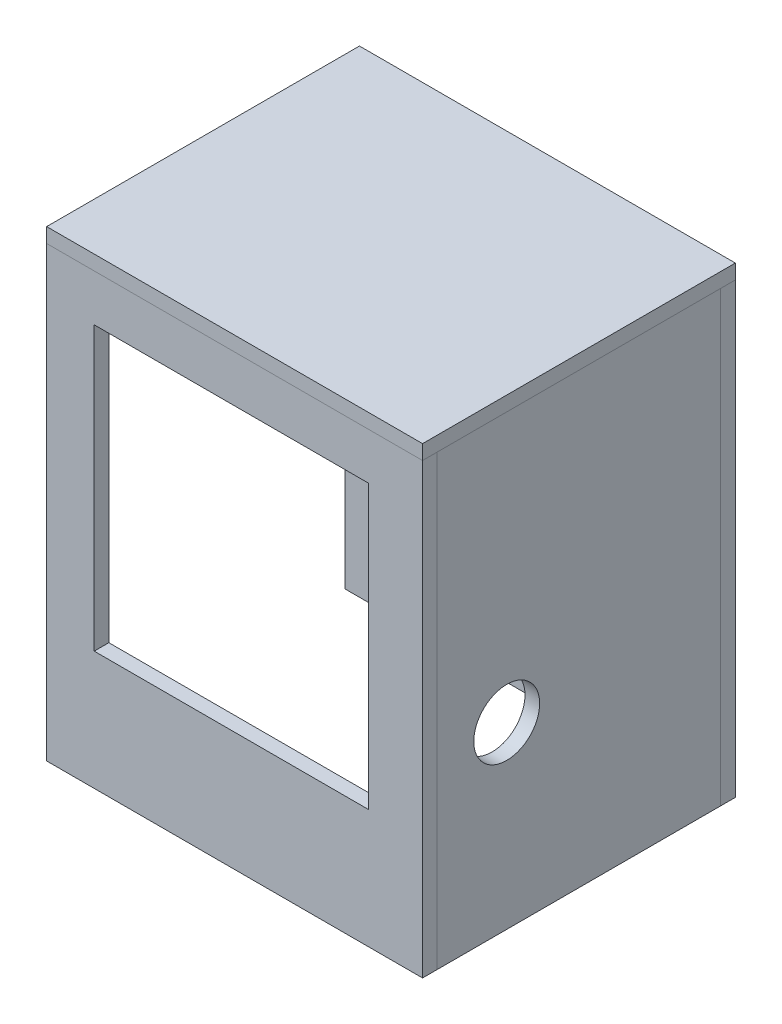
ISO-10303-21;
HEADER;
FILE_DESCRIPTION(('STEP AP214'),'2;1');
FILE_NAME('part.step','',(''),(''),'','','');
FILE_SCHEMA(('AUTOMOTIVE_DESIGN { 1 0 10303 214 1 1 1 1 }'));
ENDSEC;
DATA;
#1=APPLICATION_CONTEXT('core data for automotive mechanical design processes');
#2=APPLICATION_PROTOCOL_DEFINITION('international standard','automotive_design',2000,#1);
#3=PRODUCT_CONTEXT('',#1,'mechanical');
#4=PRODUCT('Part','Part','',(#3));
#5=PRODUCT_RELATED_PRODUCT_CATEGORY('part','',(#4));
#6=PRODUCT_DEFINITION_FORMATION('','',#4);
#7=PRODUCT_DEFINITION_CONTEXT('part definition',#1,'design');
#8=PRODUCT_DEFINITION('design','',#6,#7);
#9=PRODUCT_DEFINITION_SHAPE('','',#8);
#10=(LENGTH_UNIT() NAMED_UNIT(*) SI_UNIT(.MILLI.,.METRE.));
#11=(NAMED_UNIT(*) PLANE_ANGLE_UNIT() SI_UNIT($,.RADIAN.));
#12=(NAMED_UNIT(*) SI_UNIT($,.STERADIAN.) SOLID_ANGLE_UNIT());
#13=UNCERTAINTY_MEASURE_WITH_UNIT(LENGTH_MEASURE(1.E-05),#10,'distance_accuracy_value','');
#14=(GEOMETRIC_REPRESENTATION_CONTEXT(3) GLOBAL_UNCERTAINTY_ASSIGNED_CONTEXT((#13)) GLOBAL_UNIT_ASSIGNED_CONTEXT((#10,
#11,#12)) REPRESENTATION_CONTEXT('',''));
#15=CARTESIAN_POINT('',(0.,0.,0.));
#16=DIRECTION('',(0.,0.,1.));
#17=DIRECTION('',(1.,0.,0.));
#18=AXIS2_PLACEMENT_3D('',#15,#16,#17);
#19=CARTESIAN_POINT('',(658.8125,803.275,-517.525));
#20=DIRECTION('',(0.,0.,1.));
#21=DIRECTION('',(1.,0.,0.));
#22=AXIS2_PLACEMENT_3D('',#19,#20,#21);
#23=PLANE('',#22);
#24=DIRECTION('',(0.,-1.,0.));
#25=VECTOR('',#24,1.);
#26=CARTESIAN_POINT('',(6.35,803.275,-517.525));
#27=LINE('',#26,#25);
#28=CARTESIAN_POINT('',(6.35,803.275,-517.525));
#29=VERTEX_POINT('',#28);
#30=CARTESIAN_POINT('',(6.34999999999997,777.875,-517.525));
#31=VERTEX_POINT('',#30);
#32=EDGE_CURVE('E57',#29,#31,#27,.T.);
#33=ORIENTED_EDGE('',*,*,#32,.F.);
#34=DIRECTION('',(-1.,0.,0.));
#35=VECTOR('',#34,1.);
#36=CARTESIAN_POINT('',(658.8125,803.275,-517.525));
#37=LINE('',#36,#35);
#38=CARTESIAN_POINT('',(658.8125,803.275,-517.525));
#39=VERTEX_POINT('',#38);
#40=EDGE_CURVE('E108',#39,#29,#37,.T.);
#41=ORIENTED_EDGE('',*,*,#40,.F.);
#42=DIRECTION('',(0.,-1.,0.));
#43=VECTOR('',#42,1.);
#44=CARTESIAN_POINT('',(658.8125,803.275,-517.525));
#45=LINE('',#44,#43);
#46=CARTESIAN_POINT('',(658.8125,777.875,-517.525));
#47=VERTEX_POINT('',#46);
#48=EDGE_CURVE('E51',#39,#47,#45,.T.);
#49=ORIENTED_EDGE('',*,*,#48,.T.);
#50=DIRECTION('',(-1.,0.,0.));
#51=VECTOR('',#50,1.);
#52=CARTESIAN_POINT('',(658.8125,777.875,-517.525));
#53=LINE('',#52,#51);
#54=EDGE_CURVE('E90',#47,#31,#53,.T.);
#55=ORIENTED_EDGE('',*,*,#54,.T.);
#56=EDGE_LOOP('',(#33,#41,#49,#55));
#57=FACE_BOUND('',#56,.T.);
#58=ADVANCED_FACE('F43',(#57),#23,.F.);
#59=CARTESIAN_POINT('',(658.8125,803.275,25.4));
#60=DIRECTION('',(0.,0.,-1.));
#61=DIRECTION('',(-1.,0.,0.));
#62=AXIS2_PLACEMENT_3D('',#59,#60,#61);
#63=PLANE('',#62);
#64=DIRECTION('',(0.,1.,0.));
#65=VECTOR('',#64,1.);
#66=CARTESIAN_POINT('',(6.35,803.275,25.4));
#67=LINE('',#66,#65);
#68=CARTESIAN_POINT('',(6.35,777.875,25.4));
#69=VERTEX_POINT('',#68);
#70=CARTESIAN_POINT('',(6.35,803.275,25.4));
#71=VERTEX_POINT('',#70);
#72=EDGE_CURVE('E86',#69,#71,#67,.T.);
#73=ORIENTED_EDGE('',*,*,#72,.F.);
#74=DIRECTION('',(1.,0.,0.));
#75=VECTOR('',#74,1.);
#76=CARTESIAN_POINT('',(658.8125,777.875,25.4));
#77=LINE('',#76,#75);
#78=CARTESIAN_POINT('',(658.8125,777.875,25.4));
#79=VERTEX_POINT('',#78);
#80=EDGE_CURVE('E80',#69,#79,#77,.T.);
#81=ORIENTED_EDGE('',*,*,#80,.T.);
#82=DIRECTION('',(0.,-1.,0.));
#83=VECTOR('',#82,1.);
#84=CARTESIAN_POINT('',(658.8125,803.275,25.4));
#85=LINE('',#84,#83);
#86=CARTESIAN_POINT('',(658.8125,803.275,25.4));
#87=VERTEX_POINT('',#86);
#88=EDGE_CURVE('E83',#87,#79,#85,.T.);
#89=ORIENTED_EDGE('',*,*,#88,.F.);
#90=DIRECTION('',(1.,0.,0.));
#91=VECTOR('',#90,1.);
#92=CARTESIAN_POINT('',(658.8125,803.275,25.4));
#93=LINE('',#92,#91);
#94=EDGE_CURVE('E66',#71,#87,#93,.T.);
#95=ORIENTED_EDGE('',*,*,#94,.F.);
#96=EDGE_LOOP('',(#73,#81,#89,#95));
#97=FACE_BOUND('',#96,.T.);
#98=ADVANCED_FACE('F82',(#97),#63,.F.);
#99=CARTESIAN_POINT('',(0.,803.275,0.));
#100=DIRECTION('',(0.,1.,0.));
#101=DIRECTION('',(0.,0.,1.));
#102=AXIS2_PLACEMENT_3D('',#99,#100,#101);
#103=PLANE('',#102);
#104=ORIENTED_EDGE('',*,*,#40,.T.);
#105=DIRECTION('',(0.,0.,-1.));
#106=VECTOR('',#105,1.);
#107=CARTESIAN_POINT('',(6.35,803.275,-517.525));
#108=LINE('',#107,#106);
#109=EDGE_CURVE('E100',#71,#29,#108,.T.);
#110=ORIENTED_EDGE('',*,*,#109,.F.);
#111=ORIENTED_EDGE('',*,*,#94,.T.);
#112=DIRECTION('',(0.,0.,-1.));
#113=VECTOR('',#112,1.);
#114=CARTESIAN_POINT('',(658.8125,803.275,25.4));
#115=LINE('',#114,#113);
#116=EDGE_CURVE('E89',#87,#39,#115,.T.);
#117=ORIENTED_EDGE('',*,*,#116,.T.);
#118=EDGE_LOOP('',(#104,#110,#111,#117));
#119=FACE_BOUND('',#118,.T.);
#120=ADVANCED_FACE('F110',(#119),#103,.T.);
#121=CARTESIAN_POINT('',(0.,777.875,0.));
#122=DIRECTION('',(0.,1.,0.));
#123=DIRECTION('',(0.,0.,1.));
#124=AXIS2_PLACEMENT_3D('',#121,#122,#123);
#125=PLANE('',#124);
#126=DIRECTION('',(0.,0.,1.));
#127=VECTOR('',#126,1.);
#128=CARTESIAN_POINT('',(6.35,777.875,0.));
#129=LINE('',#128,#127);
#130=EDGE_CURVE('E12',#31,#69,#129,.T.);
#131=ORIENTED_EDGE('',*,*,#130,.F.);
#132=ORIENTED_EDGE('',*,*,#54,.F.);
#133=DIRECTION('',(0.,0.,-1.));
#134=VECTOR('',#133,1.);
#135=CARTESIAN_POINT('',(658.8125,777.875,25.4));
#136=LINE('',#135,#134);
#137=EDGE_CURVE('E95',#79,#47,#136,.T.);
#138=ORIENTED_EDGE('',*,*,#137,.F.);
#139=ORIENTED_EDGE('',*,*,#80,.F.);
#140=EDGE_LOOP('',(#131,#132,#138,#139));
#141=FACE_BOUND('',#140,.T.);
#142=ADVANCED_FACE('F97',(#141),#125,.F.);
#143=CARTESIAN_POINT('',(658.8125,803.275,25.4));
#144=DIRECTION('',(-1.,0.,0.));
#145=DIRECTION('',(0.,0.,1.));
#146=AXIS2_PLACEMENT_3D('',#143,#144,#145);
#147=PLANE('',#146);
#148=ORIENTED_EDGE('',*,*,#137,.T.);
#149=ORIENTED_EDGE('',*,*,#48,.F.);
#150=ORIENTED_EDGE('',*,*,#116,.F.);
#151=ORIENTED_EDGE('',*,*,#88,.T.);
#152=EDGE_LOOP('',(#148,#149,#150,#151));
#153=FACE_BOUND('',#152,.T.);
#154=ADVANCED_FACE('F45',(#153),#147,.F.);
#155=CARTESIAN_POINT('',(6.35,0.,0.));
#156=DIRECTION('',(-1.,0.,0.));
#157=DIRECTION('',(0.,0.,1.));
#158=AXIS2_PLACEMENT_3D('',#155,#156,#157);
#159=PLANE('',#158);
#160=ORIENTED_EDGE('',*,*,#130,.T.);
#161=ORIENTED_EDGE('',*,*,#72,.T.);
#162=ORIENTED_EDGE('',*,*,#109,.T.);
#163=ORIENTED_EDGE('',*,*,#32,.T.);
#164=EDGE_LOOP('',(#160,#161,#162,#163));
#165=FACE_BOUND('',#164,.T.);
#166=ADVANCED_FACE('F115',(#165),#159,.T.);
#167=CLOSED_SHELL('',(#58,#98,#120,#142,#154,#166));
#168=MANIFOLD_SOLID_BREP('B2',#167);
#169=CARTESIAN_POINT('',(658.8125,0.,-517.525));
#170=DIRECTION('',(0.,1.,0.));
#171=DIRECTION('',(0.,0.,1.));
#172=AXIS2_PLACEMENT_3D('',#169,#170,#171);
#173=PLANE('',#172);
#174=DIRECTION('',(0.,0.,1.));
#175=VECTOR('',#174,1.);
#176=CARTESIAN_POINT('',(6.35,0.,-517.525));
#177=LINE('',#176,#175);
#178=CARTESIAN_POINT('',(6.35,0.,-517.525));
#179=VERTEX_POINT('',#178);
#180=CARTESIAN_POINT('',(6.34999999999997,0.,-492.125));
#181=VERTEX_POINT('',#180);
#182=EDGE_CURVE('E190',#179,#181,#177,.T.);
#183=ORIENTED_EDGE('',*,*,#182,.F.);
#184=DIRECTION('',(-1.,0.,0.));
#185=VECTOR('',#184,1.);
#186=CARTESIAN_POINT('',(658.8125,0.,-517.525));
#187=LINE('',#186,#185);
#188=CARTESIAN_POINT('',(658.8125,0.,-517.525));
#189=VERTEX_POINT('',#188);
#190=EDGE_CURVE('E240',#189,#179,#187,.T.);
#191=ORIENTED_EDGE('',*,*,#190,.F.);
#192=DIRECTION('',(0.,0.,1.));
#193=VECTOR('',#192,1.);
#194=CARTESIAN_POINT('',(658.8125,0.,-517.525));
#195=LINE('',#194,#193);
#196=CARTESIAN_POINT('',(658.8125,0.,-492.125));
#197=VERTEX_POINT('',#196);
#198=EDGE_CURVE('E184',#189,#197,#195,.T.);
#199=ORIENTED_EDGE('',*,*,#198,.T.);
#200=DIRECTION('',(-1.,0.,0.));
#201=VECTOR('',#200,1.);
#202=CARTESIAN_POINT('',(658.8125,0.,-492.125));
#203=LINE('',#202,#201);
#204=EDGE_CURVE('E223',#197,#181,#203,.T.);
#205=ORIENTED_EDGE('',*,*,#204,.T.);
#206=EDGE_LOOP('',(#183,#191,#199,#205));
#207=FACE_BOUND('',#206,.T.);
#208=ADVANCED_FACE('F176',(#207),#173,.F.);
#209=CARTESIAN_POINT('',(658.8125,777.875,-517.525));
#210=DIRECTION('',(0.,-1.,0.));
#211=DIRECTION('',(0.,0.,-1.));
#212=AXIS2_PLACEMENT_3D('',#209,#210,#211);
#213=PLANE('',#212);
#214=DIRECTION('',(0.,0.,-1.));
#215=VECTOR('',#214,1.);
#216=CARTESIAN_POINT('',(6.34999999999997,777.875,-517.525));
#217=LINE('',#216,#215);
#218=CARTESIAN_POINT('',(6.35,777.875,-492.125));
#219=VERTEX_POINT('',#218);
#220=CARTESIAN_POINT('',(6.35,777.875,-517.525));
#221=VERTEX_POINT('',#220);
#222=EDGE_CURVE('E219',#219,#221,#217,.T.);
#223=ORIENTED_EDGE('',*,*,#222,.F.);
#224=DIRECTION('',(1.,0.,0.));
#225=VECTOR('',#224,1.);
#226=CARTESIAN_POINT('',(658.8125,777.875,-492.125));
#227=LINE('',#226,#225);
#228=CARTESIAN_POINT('',(658.8125,777.875,-492.125));
#229=VERTEX_POINT('',#228);
#230=EDGE_CURVE('E213',#219,#229,#227,.T.);
#231=ORIENTED_EDGE('',*,*,#230,.T.);
#232=DIRECTION('',(0.,0.,1.));
#233=VECTOR('',#232,1.);
#234=CARTESIAN_POINT('',(658.8125,777.875,-517.525));
#235=LINE('',#234,#233);
#236=CARTESIAN_POINT('',(658.8125,777.875,-517.525));
#237=VERTEX_POINT('',#236);
#238=EDGE_CURVE('E216',#237,#229,#235,.T.);
#239=ORIENTED_EDGE('',*,*,#238,.F.);
#240=DIRECTION('',(1.,0.,0.));
#241=VECTOR('',#240,1.);
#242=CARTESIAN_POINT('',(658.8125,777.875,-517.525));
#243=LINE('',#242,#241);
#244=EDGE_CURVE('E199',#221,#237,#243,.T.);
#245=ORIENTED_EDGE('',*,*,#244,.F.);
#246=EDGE_LOOP('',(#223,#231,#239,#245));
#247=FACE_BOUND('',#246,.T.);
#248=ADVANCED_FACE('F215',(#247),#213,.F.);
#249=CARTESIAN_POINT('',(0.,0.,-517.525));
#250=DIRECTION('',(0.,0.,-1.));
#251=DIRECTION('',(-1.,0.,0.));
#252=AXIS2_PLACEMENT_3D('',#249,#250,#251);
#253=PLANE('',#252);
#254=ORIENTED_EDGE('',*,*,#190,.T.);
#255=DIRECTION('',(0.,-1.,0.));
#256=VECTOR('',#255,1.);
#257=CARTESIAN_POINT('',(6.35,803.275,-517.525));
#258=LINE('',#257,#256);
#259=EDGE_CURVE('E246',#221,#179,#258,.T.);
#260=ORIENTED_EDGE('',*,*,#259,.F.);
#261=ORIENTED_EDGE('',*,*,#244,.T.);
#262=DIRECTION('',(0.,-1.,0.));
#263=VECTOR('',#262,1.);
#264=CARTESIAN_POINT('',(658.8125,777.875,-517.525));
#265=LINE('',#264,#263);
#266=EDGE_CURVE('E222',#237,#189,#265,.T.);
#267=ORIENTED_EDGE('',*,*,#266,.T.);
#268=EDGE_LOOP('',(#254,#260,#261,#267));
#269=FACE_BOUND('',#268,.T.);
#270=ADVANCED_FACE('F242',(#269),#253,.T.);
#271=CARTESIAN_POINT('',(0.,0.,-492.125));
#272=DIRECTION('',(0.,0.,-1.));
#273=DIRECTION('',(-1.,0.,0.));
#274=AXIS2_PLACEMENT_3D('',#271,#272,#273);
#275=PLANE('',#274);
#276=DIRECTION('',(0.,1.,0.));
#277=VECTOR('',#276,1.);
#278=CARTESIAN_POINT('',(6.35,0.,-492.125));
#279=LINE('',#278,#277);
#280=EDGE_CURVE('E41',#181,#219,#279,.T.);
#281=ORIENTED_EDGE('',*,*,#280,.F.);
#282=ORIENTED_EDGE('',*,*,#204,.F.);
#283=DIRECTION('',(0.,-1.,0.));
#284=VECTOR('',#283,1.);
#285=CARTESIAN_POINT('',(658.8125,777.875,-492.125));
#286=LINE('',#285,#284);
#287=EDGE_CURVE('E228',#229,#197,#286,.T.);
#288=ORIENTED_EDGE('',*,*,#287,.F.);
#289=ORIENTED_EDGE('',*,*,#230,.F.);
#290=EDGE_LOOP('',(#281,#282,#288,#289));
#291=FACE_BOUND('',#290,.T.);
#292=ADVANCED_FACE('F230',(#291),#275,.F.);
#293=CARTESIAN_POINT('',(658.8125,777.875,-517.525));
#294=DIRECTION('',(-1.,0.,0.));
#295=DIRECTION('',(0.,-1.,0.));
#296=AXIS2_PLACEMENT_3D('',#293,#294,#295);
#297=PLANE('',#296);
#298=ORIENTED_EDGE('',*,*,#287,.T.);
#299=ORIENTED_EDGE('',*,*,#198,.F.);
#300=ORIENTED_EDGE('',*,*,#266,.F.);
#301=ORIENTED_EDGE('',*,*,#238,.T.);
#302=EDGE_LOOP('',(#298,#299,#300,#301));
#303=FACE_BOUND('',#302,.T.);
#304=ADVANCED_FACE('F178',(#303),#297,.F.);
#305=CARTESIAN_POINT('',(6.35,0.,0.));
#306=DIRECTION('',(-1.,0.,0.));
#307=DIRECTION('',(0.,0.,1.));
#308=AXIS2_PLACEMENT_3D('',#305,#306,#307);
#309=PLANE('',#308);
#310=ORIENTED_EDGE('',*,*,#222,.T.);
#311=ORIENTED_EDGE('',*,*,#259,.T.);
#312=ORIENTED_EDGE('',*,*,#182,.T.);
#313=ORIENTED_EDGE('',*,*,#280,.T.);
#314=EDGE_LOOP('',(#310,#311,#312,#313));
#315=FACE_BOUND('',#314,.T.);
#316=ADVANCED_FACE('F247',(#315),#309,.T.);
#317=CLOSED_SHELL('',(#208,#248,#270,#292,#304,#316));
#318=MANIFOLD_SOLID_BREP('B6',#317);
#319=CARTESIAN_POINT('',(658.8125,0.,-492.125));
#320=DIRECTION('',(-1.,0.,0.));
#321=DIRECTION('',(0.,0.,1.));
#322=AXIS2_PLACEMENT_3D('',#319,#320,#321);
#323=PLANE('',#322);
#324=CARTESIAN_POINT('',(658.8125,311.15,-120.65));
#325=DIRECTION('',(1.,0.,0.));
#326=DIRECTION('',(0.,0.,-1.));
#327=AXIS2_PLACEMENT_3D('',#324,#325,#326);
#328=CIRCLE('',#327,57.15);
#329=CARTESIAN_POINT('',(658.8125,311.15,-177.8));
#330=VERTEX_POINT('',#329);
#331=EDGE_CURVE('E386',#330,#330,#328,.T.);
#332=ORIENTED_EDGE('',*,*,#331,.F.);
#333=EDGE_LOOP('',(#332));
#334=FACE_BOUND('',#333,.T.);
#335=DIRECTION('',(0.,-1.,0.));
#336=VECTOR('',#335,1.);
#337=CARTESIAN_POINT('',(658.8125,0.,0.));
#338=LINE('',#337,#336);
#339=CARTESIAN_POINT('',(658.8125,777.875,0.));
#340=VERTEX_POINT('',#339);
#341=CARTESIAN_POINT('',(658.8125,0.,0.));
#342=VERTEX_POINT('',#341);
#343=EDGE_CURVE('E372',#340,#342,#338,.T.);
#344=ORIENTED_EDGE('',*,*,#343,.T.);
#345=DIRECTION('',(0.,0.,1.));
#346=VECTOR('',#345,1.);
#347=CARTESIAN_POINT('',(658.8125,0.,-492.125));
#348=LINE('',#347,#346);
#349=CARTESIAN_POINT('',(658.8125,0.,-492.125));
#350=VERTEX_POINT('',#349);
#351=EDGE_CURVE('E174',#350,#342,#348,.T.);
#352=ORIENTED_EDGE('',*,*,#351,.F.);
#353=DIRECTION('',(0.,-1.,0.));
#354=VECTOR('',#353,1.);
#355=CARTESIAN_POINT('',(658.8125,0.,-492.125));
#356=LINE('',#355,#354);
#357=CARTESIAN_POINT('',(658.8125,777.875,-492.125));
#358=VERTEX_POINT('',#357);
#359=EDGE_CURVE('E360',#358,#350,#356,.T.);
#360=ORIENTED_EDGE('',*,*,#359,.F.);
#361=DIRECTION('',(0.,0.,1.));
#362=VECTOR('',#361,1.);
#363=CARTESIAN_POINT('',(658.8125,777.875,-492.125));
#364=LINE('',#363,#362);
#365=EDGE_CURVE('E368',#358,#340,#364,.T.);
#366=ORIENTED_EDGE('',*,*,#365,.T.);
#367=EDGE_LOOP('',(#344,#352,#360,#366));
#368=FACE_BOUND('',#367,.T.);
#369=ADVANCED_FACE('F309',(#334,#368),#323,.F.);
#370=CARTESIAN_POINT('',(658.8125,0.,-492.125));
#371=DIRECTION('',(0.,1.,0.));
#372=DIRECTION('',(0.,0.,1.));
#373=AXIS2_PLACEMENT_3D('',#370,#371,#372);
#374=PLANE('',#373);
#375=DIRECTION('',(-1.,0.,0.));
#376=VECTOR('',#375,1.);
#377=CARTESIAN_POINT('',(658.8125,0.,0.));
#378=LINE('',#377,#376);
#379=CARTESIAN_POINT('',(633.4125,0.,0.));
#380=VERTEX_POINT('',#379);
#381=EDGE_CURVE('E364',#342,#380,#378,.T.);
#382=ORIENTED_EDGE('',*,*,#381,.T.);
#383=DIRECTION('',(0.,0.,1.));
#384=VECTOR('',#383,1.);
#385=CARTESIAN_POINT('',(633.4125,0.,-492.125));
#386=LINE('',#385,#384);
#387=CARTESIAN_POINT('',(633.4125,0.,-492.125));
#388=VERTEX_POINT('',#387);
#389=EDGE_CURVE('E317',#388,#380,#386,.T.);
#390=ORIENTED_EDGE('',*,*,#389,.F.);
#391=DIRECTION('',(-1.,0.,0.));
#392=VECTOR('',#391,1.);
#393=CARTESIAN_POINT('',(658.8125,0.,-492.125));
#394=LINE('',#393,#392);
#395=EDGE_CURVE('E355',#350,#388,#394,.T.);
#396=ORIENTED_EDGE('',*,*,#395,.F.);
#397=ORIENTED_EDGE('',*,*,#351,.T.);
#398=EDGE_LOOP('',(#382,#390,#396,#397));
#399=FACE_BOUND('',#398,.T.);
#400=ADVANCED_FACE('F363',(#399),#374,.F.);
#401=CARTESIAN_POINT('',(633.4125,0.,-492.125));
#402=DIRECTION('',(1.,0.,0.));
#403=DIRECTION('',(0.,0.,-1.));
#404=AXIS2_PLACEMENT_3D('',#401,#402,#403);
#405=PLANE('',#404);
#406=CARTESIAN_POINT('',(633.4125,311.15,-120.65));
#407=DIRECTION('',(1.,0.,0.));
#408=DIRECTION('',(0.,0.,-1.));
#409=AXIS2_PLACEMENT_3D('',#406,#407,#408);
#410=CIRCLE('',#409,57.15);
#411=CARTESIAN_POINT('',(633.4125,311.15,-177.8));
#412=VERTEX_POINT('',#411);
#413=EDGE_CURVE('E375',#412,#412,#410,.T.);
#414=ORIENTED_EDGE('',*,*,#413,.T.);
#415=EDGE_LOOP('',(#414));
#416=FACE_BOUND('',#415,.T.);
#417=DIRECTION('',(0.,1.,0.));
#418=VECTOR('',#417,1.);
#419=CARTESIAN_POINT('',(633.4125,0.,0.));
#420=LINE('',#419,#418);
#421=CARTESIAN_POINT('',(633.4125,777.875,0.));
#422=VERTEX_POINT('',#421);
#423=EDGE_CURVE('E342',#380,#422,#420,.T.);
#424=ORIENTED_EDGE('',*,*,#423,.T.);
#425=DIRECTION('',(0.,0.,1.));
#426=VECTOR('',#425,1.);
#427=CARTESIAN_POINT('',(633.4125,777.875,-492.125));
#428=LINE('',#427,#426);
#429=CARTESIAN_POINT('',(633.4125,777.875,-492.125));
#430=VERTEX_POINT('',#429);
#431=EDGE_CURVE('E365',#430,#422,#428,.T.);
#432=ORIENTED_EDGE('',*,*,#431,.F.);
#433=DIRECTION('',(0.,1.,0.));
#434=VECTOR('',#433,1.);
#435=CARTESIAN_POINT('',(633.4125,0.,-492.125));
#436=LINE('',#435,#434);
#437=EDGE_CURVE('E358',#388,#430,#436,.T.);
#438=ORIENTED_EDGE('',*,*,#437,.F.);
#439=ORIENTED_EDGE('',*,*,#389,.T.);
#440=EDGE_LOOP('',(#424,#432,#438,#439));
#441=FACE_BOUND('',#440,.T.);
#442=ADVANCED_FACE('F366',(#416,#441),#405,.F.);
#443=CARTESIAN_POINT('',(658.8125,777.875,-492.125));
#444=DIRECTION('',(0.,-1.,0.));
#445=DIRECTION('',(0.,0.,-1.));
#446=AXIS2_PLACEMENT_3D('',#443,#444,#445);
#447=PLANE('',#446);
#448=DIRECTION('',(1.,0.,0.));
#449=VECTOR('',#448,1.);
#450=CARTESIAN_POINT('',(658.8125,777.875,0.));
#451=LINE('',#450,#449);
#452=EDGE_CURVE('E348',#422,#340,#451,.T.);
#453=ORIENTED_EDGE('',*,*,#452,.T.);
#454=ORIENTED_EDGE('',*,*,#365,.F.);
#455=DIRECTION('',(1.,0.,0.));
#456=VECTOR('',#455,1.);
#457=CARTESIAN_POINT('',(658.8125,777.875,-492.125));
#458=LINE('',#457,#456);
#459=EDGE_CURVE('E325',#430,#358,#458,.T.);
#460=ORIENTED_EDGE('',*,*,#459,.F.);
#461=ORIENTED_EDGE('',*,*,#431,.T.);
#462=EDGE_LOOP('',(#453,#454,#460,#461));
#463=FACE_BOUND('',#462,.T.);
#464=ADVANCED_FACE('F380',(#463),#447,.F.);
#465=CARTESIAN_POINT('',(0.,0.,-492.125));
#466=DIRECTION('',(0.,0.,1.));
#467=DIRECTION('',(1.,0.,0.));
#468=AXIS2_PLACEMENT_3D('',#465,#466,#467);
#469=PLANE('',#468);
#470=ORIENTED_EDGE('',*,*,#359,.T.);
#471=ORIENTED_EDGE('',*,*,#395,.T.);
#472=ORIENTED_EDGE('',*,*,#437,.T.);
#473=ORIENTED_EDGE('',*,*,#459,.T.);
#474=EDGE_LOOP('',(#470,#471,#472,#473));
#475=FACE_BOUND('',#474,.T.);
#476=ADVANCED_FACE('F356',(#475),#469,.F.);
#477=CARTESIAN_POINT('',(0.,0.,0.));
#478=DIRECTION('',(0.,0.,1.));
#479=DIRECTION('',(1.,0.,0.));
#480=AXIS2_PLACEMENT_3D('',#477,#478,#479);
#481=PLANE('',#480);
#482=ORIENTED_EDGE('',*,*,#343,.F.);
#483=ORIENTED_EDGE('',*,*,#452,.F.);
#484=ORIENTED_EDGE('',*,*,#423,.F.);
#485=ORIENTED_EDGE('',*,*,#381,.F.);
#486=EDGE_LOOP('',(#482,#483,#484,#485));
#487=FACE_BOUND('',#486,.T.);
#488=ADVANCED_FACE('F383',(#487),#481,.T.);
#489=CARTESIAN_POINT('',(633.4125,311.15,-120.65));
#490=DIRECTION('',(1.,0.,0.));
#491=DIRECTION('',(0.,0.,-1.));
#492=AXIS2_PLACEMENT_3D('',#489,#490,#491);
#493=CYLINDRICAL_SURFACE('',#492,57.15);
#494=ORIENTED_EDGE('',*,*,#413,.F.);
#495=EDGE_LOOP('',(#494));
#496=FACE_BOUND('',#495,.T.);
#497=ORIENTED_EDGE('',*,*,#331,.T.);
#498=EDGE_LOOP('',(#497));
#499=FACE_BOUND('',#498,.T.);
#500=ADVANCED_FACE('F393',(#496,#499),#493,.F.);
#501=CLOSED_SHELL('',(#369,#400,#442,#464,#476,#488,#500));
#502=MANIFOLD_SOLID_BREP('B35',#501);
#503=CARTESIAN_POINT('',(0.,0.,25.4));
#504=DIRECTION('',(0.,1.,0.));
#505=DIRECTION('',(0.,0.,1.));
#506=AXIS2_PLACEMENT_3D('',#503,#504,#505);
#507=PLANE('',#506);
#508=DIRECTION('',(0.,0.,1.));
#509=VECTOR('',#508,1.);
#510=CARTESIAN_POINT('',(6.35,0.,-517.525));
#511=LINE('',#510,#509);
#512=CARTESIAN_POINT('',(6.35,0.,0.));
#513=VERTEX_POINT('',#512);
#514=CARTESIAN_POINT('',(6.35,0.,25.4));
#515=VERTEX_POINT('',#514);
#516=EDGE_CURVE('E523',#513,#515,#511,.T.);
#517=ORIENTED_EDGE('',*,*,#516,.F.);
#518=DIRECTION('',(1.,0.,0.));
#519=VECTOR('',#518,1.);
#520=CARTESIAN_POINT('',(0.,0.,0.));
#521=LINE('',#520,#519);
#522=CARTESIAN_POINT('',(658.8125,0.,0.));
#523=VERTEX_POINT('',#522);
#524=EDGE_CURVE('E557',#513,#523,#521,.T.);
#525=ORIENTED_EDGE('',*,*,#524,.T.);
#526=DIRECTION('',(0.,0.,-1.));
#527=VECTOR('',#526,1.);
#528=CARTESIAN_POINT('',(658.8125,0.,25.4));
#529=LINE('',#528,#527);
#530=CARTESIAN_POINT('',(658.8125,0.,25.4));
#531=VERTEX_POINT('',#530);
#532=EDGE_CURVE('E460',#531,#523,#529,.T.);
#533=ORIENTED_EDGE('',*,*,#532,.F.);
#534=DIRECTION('',(1.,0.,0.));
#535=VECTOR('',#534,1.);
#536=CARTESIAN_POINT('',(0.,0.,25.4));
#537=LINE('',#536,#535);
#538=EDGE_CURVE('E558',#515,#531,#537,.T.);
#539=ORIENTED_EDGE('',*,*,#538,.F.);
#540=EDGE_LOOP('',(#517,#525,#533,#539));
#541=FACE_BOUND('',#540,.T.);
#542=ADVANCED_FACE('F453',(#541),#507,.F.);
#543=CARTESIAN_POINT('',(0.,777.875,25.4));
#544=DIRECTION('',(0.,-1.,0.));
#545=DIRECTION('',(0.,0.,-1.));
#546=AXIS2_PLACEMENT_3D('',#543,#544,#545);
#547=PLANE('',#546);
#548=DIRECTION('',(0.,0.,-1.));
#549=VECTOR('',#548,1.);
#550=CARTESIAN_POINT('',(6.35,777.875,25.4));
#551=LINE('',#550,#549);
#552=CARTESIAN_POINT('',(6.35,777.875,25.4));
#553=VERTEX_POINT('',#552);
#554=CARTESIAN_POINT('',(6.35,777.875,0.));
#555=VERTEX_POINT('',#554);
#556=EDGE_CURVE('E555',#553,#555,#551,.T.);
#557=ORIENTED_EDGE('',*,*,#556,.F.);
#558=DIRECTION('',(-1.,0.,0.));
#559=VECTOR('',#558,1.);
#560=CARTESIAN_POINT('',(0.,777.875,25.4));
#561=LINE('',#560,#559);
#562=CARTESIAN_POINT('',(658.8125,777.875,25.4));
#563=VERTEX_POINT('',#562);
#564=EDGE_CURVE('E563',#563,#553,#561,.T.);
#565=ORIENTED_EDGE('',*,*,#564,.F.);
#566=DIRECTION('',(0.,0.,-1.));
#567=VECTOR('',#566,1.);
#568=CARTESIAN_POINT('',(658.8125,777.875,25.4));
#569=LINE('',#568,#567);
#570=CARTESIAN_POINT('',(658.8125,777.875,0.));
#571=VERTEX_POINT('',#570);
#572=EDGE_CURVE('E566',#563,#571,#569,.T.);
#573=ORIENTED_EDGE('',*,*,#572,.T.);
#574=DIRECTION('',(-1.,0.,0.));
#575=VECTOR('',#574,1.);
#576=CARTESIAN_POINT('',(0.,777.875,0.));
#577=LINE('',#576,#575);
#578=EDGE_CURVE('E561',#571,#555,#577,.T.);
#579=ORIENTED_EDGE('',*,*,#578,.T.);
#580=EDGE_LOOP('',(#557,#565,#573,#579));
#581=FACE_BOUND('',#580,.T.);
#582=ADVANCED_FACE('F586',(#581),#547,.F.);
#583=CARTESIAN_POINT('',(0.,0.,25.4));
#584=DIRECTION('',(0.,0.,-1.));
#585=DIRECTION('',(-1.,0.,0.));
#586=AXIS2_PLACEMENT_3D('',#583,#584,#585);
#587=PLANE('',#586);
#588=DIRECTION('',(1.,0.,0.));
#589=VECTOR('',#588,1.);
#590=CARTESIAN_POINT('',(88.9,206.375,25.4));
#591=LINE('',#590,#589);
#592=CARTESIAN_POINT('',(88.9,206.375,25.4));
#593=VERTEX_POINT('',#592);
#594=CARTESIAN_POINT('',(565.15,206.375,25.4));
#595=VERTEX_POINT('',#594);
#596=EDGE_CURVE('E536',#593,#595,#591,.T.);
#597=ORIENTED_EDGE('',*,*,#596,.F.);
#598=DIRECTION('',(0.,-1.,0.));
#599=VECTOR('',#598,1.);
#600=CARTESIAN_POINT('',(88.9,696.9125,25.4));
#601=LINE('',#600,#599);
#602=CARTESIAN_POINT('',(88.9,696.9125,25.4));
#603=VERTEX_POINT('',#602);
#604=EDGE_CURVE('E467',#603,#593,#601,.T.);
#605=ORIENTED_EDGE('',*,*,#604,.F.);
#606=DIRECTION('',(-1.,0.,0.));
#607=VECTOR('',#606,1.);
#608=CARTESIAN_POINT('',(88.9,696.9125,25.4));
#609=LINE('',#608,#607);
#610=CARTESIAN_POINT('',(565.15,696.9125,25.4));
#611=VERTEX_POINT('',#610);
#612=EDGE_CURVE('E529',#611,#603,#609,.T.);
#613=ORIENTED_EDGE('',*,*,#612,.F.);
#614=DIRECTION('',(0.,1.,0.));
#615=VECTOR('',#614,1.);
#616=CARTESIAN_POINT('',(565.15,696.9125,25.4));
#617=LINE('',#616,#615);
#618=EDGE_CURVE('E543',#595,#611,#617,.T.);
#619=ORIENTED_EDGE('',*,*,#618,.F.);
#620=EDGE_LOOP('',(#597,#605,#613,#619));
#621=FACE_BOUND('',#620,.T.);
#622=DIRECTION('',(0.,1.,0.));
#623=VECTOR('',#622,1.);
#624=CARTESIAN_POINT('',(6.35,803.275,25.4));
#625=LINE('',#624,#623);
#626=EDGE_CURVE('E553',#515,#553,#625,.T.);
#627=ORIENTED_EDGE('',*,*,#626,.F.);
#628=ORIENTED_EDGE('',*,*,#538,.T.);
#629=DIRECTION('',(0.,1.,0.));
#630=VECTOR('',#629,1.);
#631=CARTESIAN_POINT('',(658.8125,0.,25.4));
#632=LINE('',#631,#630);
#633=EDGE_CURVE('E560',#531,#563,#632,.T.);
#634=ORIENTED_EDGE('',*,*,#633,.T.);
#635=ORIENTED_EDGE('',*,*,#564,.T.);
#636=EDGE_LOOP('',(#627,#628,#634,#635));
#637=FACE_BOUND('',#636,.T.);
#638=ADVANCED_FACE('F590',(#621,#637),#587,.F.);
#639=CARTESIAN_POINT('',(0.,0.,0.));
#640=DIRECTION('',(0.,0.,-1.));
#641=DIRECTION('',(-1.,0.,0.));
#642=AXIS2_PLACEMENT_3D('',#639,#640,#641);
#643=PLANE('',#642);
#644=DIRECTION('',(0.,-1.,0.));
#645=VECTOR('',#644,1.);
#646=CARTESIAN_POINT('',(88.9,696.9125,0.));
#647=LINE('',#646,#645);
#648=CARTESIAN_POINT('',(88.9,696.9125,0.));
#649=VERTEX_POINT('',#648);
#650=CARTESIAN_POINT('',(88.9,206.375,0.));
#651=VERTEX_POINT('',#650);
#652=EDGE_CURVE('E527',#649,#651,#647,.T.);
#653=ORIENTED_EDGE('',*,*,#652,.T.);
#654=DIRECTION('',(1.,0.,0.));
#655=VECTOR('',#654,1.);
#656=CARTESIAN_POINT('',(88.9,206.375,0.));
#657=LINE('',#656,#655);
#658=CARTESIAN_POINT('',(565.15,206.375,0.));
#659=VERTEX_POINT('',#658);
#660=EDGE_CURVE('E516',#651,#659,#657,.T.);
#661=ORIENTED_EDGE('',*,*,#660,.T.);
#662=DIRECTION('',(0.,1.,0.));
#663=VECTOR('',#662,1.);
#664=CARTESIAN_POINT('',(565.15,696.9125,0.));
#665=LINE('',#664,#663);
#666=CARTESIAN_POINT('',(565.15,696.9125,0.));
#667=VERTEX_POINT('',#666);
#668=EDGE_CURVE('E538',#659,#667,#665,.T.);
#669=ORIENTED_EDGE('',*,*,#668,.T.);
#670=DIRECTION('',(-1.,0.,0.));
#671=VECTOR('',#670,1.);
#672=CARTESIAN_POINT('',(88.9,696.9125,0.));
#673=LINE('',#672,#671);
#674=EDGE_CURVE('E534',#667,#649,#673,.T.);
#675=ORIENTED_EDGE('',*,*,#674,.T.);
#676=EDGE_LOOP('',(#653,#661,#669,#675));
#677=FACE_BOUND('',#676,.T.);
#678=ORIENTED_EDGE('',*,*,#524,.F.);
#679=DIRECTION('',(0.,1.,0.));
#680=VECTOR('',#679,1.);
#681=CARTESIAN_POINT('',(6.35,0.,0.));
#682=LINE('',#681,#680);
#683=EDGE_CURVE('E307',#513,#555,#682,.T.);
#684=ORIENTED_EDGE('',*,*,#683,.T.);
#685=ORIENTED_EDGE('',*,*,#578,.F.);
#686=DIRECTION('',(0.,1.,0.));
#687=VECTOR('',#686,1.);
#688=CARTESIAN_POINT('',(658.8125,0.,0.));
#689=LINE('',#688,#687);
#690=EDGE_CURVE('E568',#523,#571,#689,.T.);
#691=ORIENTED_EDGE('',*,*,#690,.F.);
#692=EDGE_LOOP('',(#678,#684,#685,#691));
#693=FACE_BOUND('',#692,.T.);
#694=ADVANCED_FACE('F532',(#677,#693),#643,.T.);
#695=CARTESIAN_POINT('',(658.8125,0.,25.4));
#696=DIRECTION('',(-1.,0.,0.));
#697=DIRECTION('',(0.,0.,1.));
#698=AXIS2_PLACEMENT_3D('',#695,#696,#697);
#699=PLANE('',#698);
#700=ORIENTED_EDGE('',*,*,#690,.T.);
#701=ORIENTED_EDGE('',*,*,#572,.F.);
#702=ORIENTED_EDGE('',*,*,#633,.F.);
#703=ORIENTED_EDGE('',*,*,#532,.T.);
#704=EDGE_LOOP('',(#700,#701,#702,#703));
#705=FACE_BOUND('',#704,.T.);
#706=ADVANCED_FACE('F578',(#705),#699,.F.);
#707=CARTESIAN_POINT('',(6.35,0.,0.));
#708=DIRECTION('',(-1.,0.,0.));
#709=DIRECTION('',(0.,0.,1.));
#710=AXIS2_PLACEMENT_3D('',#707,#708,#709);
#711=PLANE('',#710);
#712=ORIENTED_EDGE('',*,*,#556,.T.);
#713=ORIENTED_EDGE('',*,*,#683,.F.);
#714=ORIENTED_EDGE('',*,*,#516,.T.);
#715=ORIENTED_EDGE('',*,*,#626,.T.);
#716=EDGE_LOOP('',(#712,#713,#714,#715));
#717=FACE_BOUND('',#716,.T.);
#718=ADVANCED_FACE('F593',(#717),#711,.T.);
#719=CARTESIAN_POINT('',(88.9,696.9125,-517.526));
#720=DIRECTION('',(-1.,0.,0.));
#721=DIRECTION('',(0.,-1.,0.));
#722=AXIS2_PLACEMENT_3D('',#719,#720,#721);
#723=PLANE('',#722);
#724=DIRECTION('',(0.,0.,1.));
#725=VECTOR('',#724,1.);
#726=CARTESIAN_POINT('',(88.9,696.9125,-517.526));
#727=LINE('',#726,#725);
#728=EDGE_CURVE('E524',#649,#603,#727,.T.);
#729=ORIENTED_EDGE('',*,*,#728,.T.);
#730=ORIENTED_EDGE('',*,*,#604,.T.);
#731=DIRECTION('',(0.,0.,1.));
#732=VECTOR('',#731,1.);
#733=CARTESIAN_POINT('',(88.9,206.375,-517.526));
#734=LINE('',#733,#732);
#735=EDGE_CURVE('E518',#651,#593,#734,.T.);
#736=ORIENTED_EDGE('',*,*,#735,.F.);
#737=ORIENTED_EDGE('',*,*,#652,.F.);
#738=EDGE_LOOP('',(#729,#730,#736,#737));
#739=FACE_BOUND('',#738,.T.);
#740=ADVANCED_FACE('F526',(#739),#723,.F.);
#741=CARTESIAN_POINT('',(88.9,696.9125,-517.526));
#742=DIRECTION('',(0.,1.,0.));
#743=DIRECTION('',(0.,0.,1.));
#744=AXIS2_PLACEMENT_3D('',#741,#742,#743);
#745=PLANE('',#744);
#746=DIRECTION('',(0.,0.,1.));
#747=VECTOR('',#746,1.);
#748=CARTESIAN_POINT('',(565.15,696.9125,-517.526));
#749=LINE('',#748,#747);
#750=EDGE_CURVE('E549',#667,#611,#749,.T.);
#751=ORIENTED_EDGE('',*,*,#750,.T.);
#752=ORIENTED_EDGE('',*,*,#612,.T.);
#753=ORIENTED_EDGE('',*,*,#728,.F.);
#754=ORIENTED_EDGE('',*,*,#674,.F.);
#755=EDGE_LOOP('',(#751,#752,#753,#754));
#756=FACE_BOUND('',#755,.T.);
#757=ADVANCED_FACE('F600',(#756),#745,.F.);
#758=CARTESIAN_POINT('',(565.15,696.9125,-517.526));
#759=DIRECTION('',(1.,0.,0.));
#760=DIRECTION('',(0.,0.,-1.));
#761=AXIS2_PLACEMENT_3D('',#758,#759,#760);
#762=PLANE('',#761);
#763=DIRECTION('',(0.,0.,1.));
#764=VECTOR('',#763,1.);
#765=CARTESIAN_POINT('',(565.15,206.375,-517.526));
#766=LINE('',#765,#764);
#767=EDGE_CURVE('E475',#659,#595,#766,.T.);
#768=ORIENTED_EDGE('',*,*,#767,.T.);
#769=ORIENTED_EDGE('',*,*,#618,.T.);
#770=ORIENTED_EDGE('',*,*,#750,.F.);
#771=ORIENTED_EDGE('',*,*,#668,.F.);
#772=EDGE_LOOP('',(#768,#769,#770,#771));
#773=FACE_BOUND('',#772,.T.);
#774=ADVANCED_FACE('F655',(#773),#762,.F.);
#775=CARTESIAN_POINT('',(88.9,206.375,-517.526));
#776=DIRECTION('',(0.,-1.,0.));
#777=DIRECTION('',(0.,0.,-1.));
#778=AXIS2_PLACEMENT_3D('',#775,#776,#777);
#779=PLANE('',#778);
#780=ORIENTED_EDGE('',*,*,#735,.T.);
#781=ORIENTED_EDGE('',*,*,#596,.T.);
#782=ORIENTED_EDGE('',*,*,#767,.F.);
#783=ORIENTED_EDGE('',*,*,#660,.F.);
#784=EDGE_LOOP('',(#780,#781,#782,#783));
#785=FACE_BOUND('',#784,.T.);
#786=ADVANCED_FACE('F517',(#785),#779,.F.);
#787=CLOSED_SHELL('',(#542,#582,#638,#694,#706,#718,#740,#757,#774,#786));
#788=MANIFOLD_SOLID_BREP('B168',#787);
#789=ADVANCED_BREP_SHAPE_REPRESENTATION('',(#18,#168,#318,#502,#788),#14);
#790=SHAPE_DEFINITION_REPRESENTATION(#9,#789);
ENDSEC;
END-ISO-10303-21;
